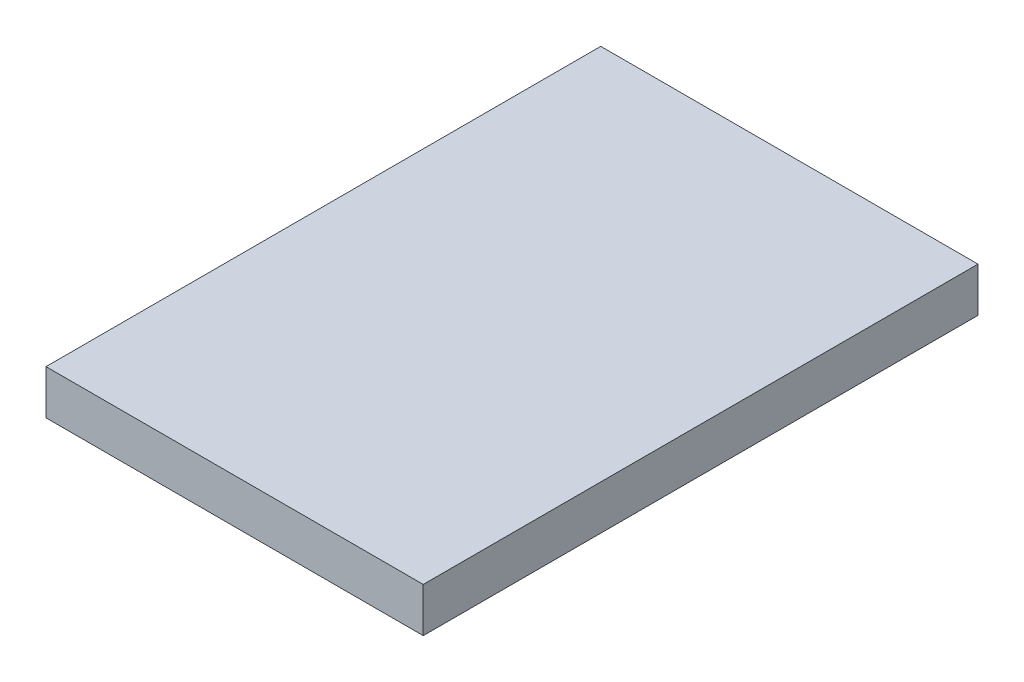
ISO-10303-21;
HEADER;
FILE_DESCRIPTION(('STEP AP214'),'2;1');
FILE_NAME('part.step','',(''),(''),'','','');
FILE_SCHEMA(('AUTOMOTIVE_DESIGN { 1 0 10303 214 1 1 1 1 }'));
ENDSEC;
DATA;
#1=APPLICATION_CONTEXT('core data for automotive mechanical design processes');
#2=APPLICATION_PROTOCOL_DEFINITION('international standard','automotive_design',2000,#1);
#3=PRODUCT_CONTEXT('',#1,'mechanical');
#4=PRODUCT('Part','Part','',(#3));
#5=PRODUCT_RELATED_PRODUCT_CATEGORY('part','',(#4));
#6=PRODUCT_DEFINITION_FORMATION('','',#4);
#7=PRODUCT_DEFINITION_CONTEXT('part definition',#1,'design');
#8=PRODUCT_DEFINITION('design','',#6,#7);
#9=PRODUCT_DEFINITION_SHAPE('','',#8);
#10=(LENGTH_UNIT() NAMED_UNIT(*) SI_UNIT(.MILLI.,.METRE.));
#11=(NAMED_UNIT(*) PLANE_ANGLE_UNIT() SI_UNIT($,.RADIAN.));
#12=(NAMED_UNIT(*) SI_UNIT($,.STERADIAN.) SOLID_ANGLE_UNIT());
#13=UNCERTAINTY_MEASURE_WITH_UNIT(LENGTH_MEASURE(1.E-05),#10,'distance_accuracy_value','');
#14=(GEOMETRIC_REPRESENTATION_CONTEXT(3) GLOBAL_UNCERTAINTY_ASSIGNED_CONTEXT((#13)) GLOBAL_UNIT_ASSIGNED_CONTEXT((#10,
#11,#12)) REPRESENTATION_CONTEXT('',''));
#15=CARTESIAN_POINT('',(0.,0.,0.));
#16=DIRECTION('',(0.,0.,1.));
#17=DIRECTION('',(1.,0.,0.));
#18=AXIS2_PLACEMENT_3D('',#15,#16,#17);
#19=CARTESIAN_POINT('',(0.,0.,0.));
#20=DIRECTION('',(0.,-1.,0.));
#21=DIRECTION('',(0.,0.,-1.));
#22=AXIS2_PLACEMENT_3D('',#19,#20,#21);
#23=PLANE('',#22);
#24=DIRECTION('',(0.,0.,-1.));
#25=VECTOR('',#24,1.);
#26=CARTESIAN_POINT('',(-8.50000000000001,0.,12.5));
#27=LINE('',#26,#25);
#28=CARTESIAN_POINT('',(-8.50000000000001,0.,12.5));
#29=VERTEX_POINT('',#28);
#30=CARTESIAN_POINT('',(-8.50000000000001,0.,-12.5));
#31=VERTEX_POINT('',#30);
#32=EDGE_CURVE('E55',#29,#31,#27,.T.);
#33=ORIENTED_EDGE('',*,*,#32,.T.);
#34=DIRECTION('',(1.,0.,0.));
#35=VECTOR('',#34,1.);
#36=CARTESIAN_POINT('',(-8.50000000000001,0.,-12.5));
#37=LINE('',#36,#35);
#38=CARTESIAN_POINT('',(8.50000000000001,0.,-12.5));
#39=VERTEX_POINT('',#38);
#40=EDGE_CURVE('E76',#31,#39,#37,.T.);
#41=ORIENTED_EDGE('',*,*,#40,.T.);
#42=DIRECTION('',(0.,0.,1.));
#43=VECTOR('',#42,1.);
#44=CARTESIAN_POINT('',(8.50000000000001,0.,12.5));
#45=LINE('',#44,#43);
#46=CARTESIAN_POINT('',(8.50000000000001,0.,12.5));
#47=VERTEX_POINT('',#46);
#48=EDGE_CURVE('E58',#39,#47,#45,.T.);
#49=ORIENTED_EDGE('',*,*,#48,.T.);
#50=DIRECTION('',(-1.,0.,0.));
#51=VECTOR('',#50,1.);
#52=CARTESIAN_POINT('',(-8.50000000000001,0.,12.5));
#53=LINE('',#52,#51);
#54=EDGE_CURVE('E20',#47,#29,#53,.T.);
#55=ORIENTED_EDGE('',*,*,#54,.T.);
#56=EDGE_LOOP('',(#33,#41,#49,#55));
#57=FACE_BOUND('',#56,.T.);
#58=ADVANCED_FACE('F17',(#57),#23,.T.);
#59=CARTESIAN_POINT('',(-8.50000000000001,1.99999999999999,12.5));
#60=DIRECTION('',(0.,0.,-1.));
#61=DIRECTION('',(-1.,0.,0.));
#62=AXIS2_PLACEMENT_3D('',#59,#60,#61);
#63=PLANE('',#62);
#64=DIRECTION('',(0.,1.,0.));
#65=VECTOR('',#64,1.);
#66=CARTESIAN_POINT('',(8.50000000000001,2.,12.5));
#67=LINE('',#66,#65);
#68=CARTESIAN_POINT('',(8.50000000000001,2.,12.5));
#69=VERTEX_POINT('',#68);
#70=EDGE_CURVE('E78',#47,#69,#67,.T.);
#71=ORIENTED_EDGE('',*,*,#70,.T.);
#72=DIRECTION('',(1.,0.,0.));
#73=VECTOR('',#72,1.);
#74=CARTESIAN_POINT('',(0.,2.,12.5));
#75=LINE('',#74,#73);
#76=CARTESIAN_POINT('',(-8.50000000000001,2.,12.5));
#77=VERTEX_POINT('',#76);
#78=EDGE_CURVE('E73',#69,#77,#75,.F.);
#79=ORIENTED_EDGE('',*,*,#78,.T.);
#80=DIRECTION('',(0.,1.,0.));
#81=VECTOR('',#80,1.);
#82=CARTESIAN_POINT('',(-8.50000000000001,1.99999999999999,12.5));
#83=LINE('',#82,#81);
#84=EDGE_CURVE('E63',#77,#29,#83,.F.);
#85=ORIENTED_EDGE('',*,*,#84,.T.);
#86=ORIENTED_EDGE('',*,*,#54,.F.);
#87=EDGE_LOOP('',(#71,#79,#85,#86));
#88=FACE_BOUND('',#87,.T.);
#89=ADVANCED_FACE('F72',(#88),#63,.F.);
#90=CARTESIAN_POINT('',(-8.50000000000001,1.99999999999999,12.5));
#91=DIRECTION('',(1.,0.,0.));
#92=DIRECTION('',(0.,0.,-1.));
#93=AXIS2_PLACEMENT_3D('',#90,#91,#92);
#94=PLANE('',#93);
#95=ORIENTED_EDGE('',*,*,#84,.F.);
#96=DIRECTION('',(0.,0.,-1.));
#97=VECTOR('',#96,1.);
#98=CARTESIAN_POINT('',(-8.50000000000001,2.,0.));
#99=LINE('',#98,#97);
#100=CARTESIAN_POINT('',(-8.50000000000001,2.,-12.5));
#101=VERTEX_POINT('',#100);
#102=EDGE_CURVE('E83',#77,#101,#99,.T.);
#103=ORIENTED_EDGE('',*,*,#102,.T.);
#104=DIRECTION('',(0.,1.,0.));
#105=VECTOR('',#104,1.);
#106=CARTESIAN_POINT('',(-8.50000000000001,1.99999999999999,-12.5));
#107=LINE('',#106,#105);
#108=EDGE_CURVE('E69',#101,#31,#107,.F.);
#109=ORIENTED_EDGE('',*,*,#108,.T.);
#110=ORIENTED_EDGE('',*,*,#32,.F.);
#111=EDGE_LOOP('',(#95,#103,#109,#110));
#112=FACE_BOUND('',#111,.T.);
#113=ADVANCED_FACE('F66',(#112),#94,.F.);
#114=CARTESIAN_POINT('',(-8.50000000000001,1.99999999999999,-12.5));
#115=DIRECTION('',(0.,0.,1.));
#116=DIRECTION('',(1.,0.,0.));
#117=AXIS2_PLACEMENT_3D('',#114,#115,#116);
#118=PLANE('',#117);
#119=ORIENTED_EDGE('',*,*,#108,.F.);
#120=DIRECTION('',(1.,0.,0.));
#121=VECTOR('',#120,1.);
#122=CARTESIAN_POINT('',(0.,2.,-12.5));
#123=LINE('',#122,#121);
#124=CARTESIAN_POINT('',(8.50000000000001,2.,-12.5));
#125=VERTEX_POINT('',#124);
#126=EDGE_CURVE('E26',#101,#125,#123,.T.);
#127=ORIENTED_EDGE('',*,*,#126,.T.);
#128=DIRECTION('',(0.,1.,0.));
#129=VECTOR('',#128,1.);
#130=CARTESIAN_POINT('',(8.50000000000001,2.,-12.5));
#131=LINE('',#130,#129);
#132=EDGE_CURVE('E34',#125,#39,#131,.F.);
#133=ORIENTED_EDGE('',*,*,#132,.T.);
#134=ORIENTED_EDGE('',*,*,#40,.F.);
#135=EDGE_LOOP('',(#119,#127,#133,#134));
#136=FACE_BOUND('',#135,.T.);
#137=ADVANCED_FACE('F88',(#136),#118,.F.);
#138=CARTESIAN_POINT('',(8.50000000000001,2.,12.5));
#139=DIRECTION('',(-1.,0.,0.));
#140=DIRECTION('',(0.,0.,1.));
#141=AXIS2_PLACEMENT_3D('',#138,#139,#140);
#142=PLANE('',#141);
#143=ORIENTED_EDGE('',*,*,#132,.F.);
#144=DIRECTION('',(0.,0.,-1.));
#145=VECTOR('',#144,1.);
#146=CARTESIAN_POINT('',(8.50000000000001,2.,0.));
#147=LINE('',#146,#145);
#148=EDGE_CURVE('E11',#125,#69,#147,.F.);
#149=ORIENTED_EDGE('',*,*,#148,.T.);
#150=ORIENTED_EDGE('',*,*,#70,.F.);
#151=ORIENTED_EDGE('',*,*,#48,.F.);
#152=EDGE_LOOP('',(#143,#149,#150,#151));
#153=FACE_BOUND('',#152,.T.);
#154=ADVANCED_FACE('F91',(#153),#142,.F.);
#155=CARTESIAN_POINT('',(0.,2.,0.));
#156=DIRECTION('',(0.,-1.,0.));
#157=DIRECTION('',(0.,0.,-1.));
#158=AXIS2_PLACEMENT_3D('',#155,#156,#157);
#159=PLANE('',#158);
#160=ORIENTED_EDGE('',*,*,#126,.F.);
#161=ORIENTED_EDGE('',*,*,#102,.F.);
#162=ORIENTED_EDGE('',*,*,#78,.F.);
#163=ORIENTED_EDGE('',*,*,#148,.F.);
#164=EDGE_LOOP('',(#160,#161,#162,#163));
#165=FACE_BOUND('',#164,.T.);
#166=ADVANCED_FACE('F90',(#165),#159,.F.);
#167=CLOSED_SHELL('',(#58,#89,#113,#137,#154,#166));
#168=MANIFOLD_SOLID_BREP('B1',#167);
#169=ADVANCED_BREP_SHAPE_REPRESENTATION('',(#18,#168),#14);
#170=SHAPE_DEFINITION_REPRESENTATION(#9,#169);
ENDSEC;
END-ISO-10303-21;
